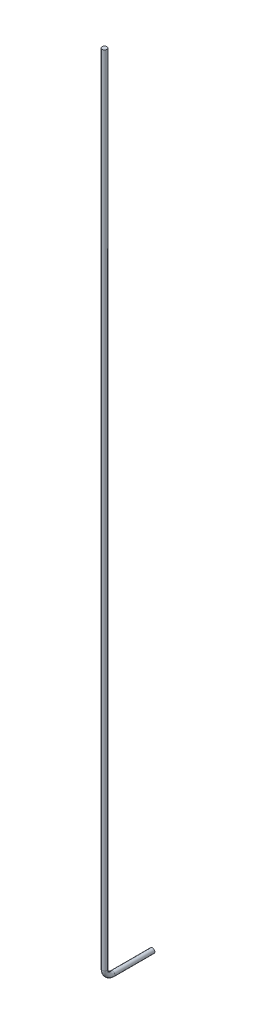
ISO-10303-21;
HEADER;
FILE_DESCRIPTION(('STEP AP214'),'2;1');
FILE_NAME('part.step','',(''),(''),'','','');
FILE_SCHEMA(('AUTOMOTIVE_DESIGN { 1 0 10303 214 1 1 1 1 }'));
ENDSEC;
DATA;
#1=APPLICATION_CONTEXT('core data for automotive mechanical design processes');
#2=APPLICATION_PROTOCOL_DEFINITION('international standard','automotive_design',2000,#1);
#3=PRODUCT_CONTEXT('',#1,'mechanical');
#4=PRODUCT('Part','Part','',(#3));
#5=PRODUCT_RELATED_PRODUCT_CATEGORY('part','',(#4));
#6=PRODUCT_DEFINITION_FORMATION('','',#4);
#7=PRODUCT_DEFINITION_CONTEXT('part definition',#1,'design');
#8=PRODUCT_DEFINITION('design','',#6,#7);
#9=PRODUCT_DEFINITION_SHAPE('','',#8);
#10=(LENGTH_UNIT() NAMED_UNIT(*) SI_UNIT(.MILLI.,.METRE.));
#11=(NAMED_UNIT(*) PLANE_ANGLE_UNIT() SI_UNIT($,.RADIAN.));
#12=(NAMED_UNIT(*) SI_UNIT($,.STERADIAN.) SOLID_ANGLE_UNIT());
#13=UNCERTAINTY_MEASURE_WITH_UNIT(LENGTH_MEASURE(1.E-05),#10,'distance_accuracy_value','');
#14=(GEOMETRIC_REPRESENTATION_CONTEXT(3) GLOBAL_UNCERTAINTY_ASSIGNED_CONTEXT((#13)) GLOBAL_UNIT_ASSIGNED_CONTEXT((#10,
#11,#12)) REPRESENTATION_CONTEXT('',''));
#15=CARTESIAN_POINT('',(0.,0.,0.));
#16=DIRECTION('',(0.,0.,1.));
#17=DIRECTION('',(1.,0.,0.));
#18=AXIS2_PLACEMENT_3D('',#15,#16,#17);
#19=CARTESIAN_POINT('',(0.,0.,20.));
#20=DIRECTION('',(0.,0.,-1.));
#21=DIRECTION('',(-1.,0.,0.));
#22=AXIS2_PLACEMENT_3D('',#19,#20,#21);
#23=CYLINDRICAL_SURFACE('',#22,1.5);
#24=CARTESIAN_POINT('',(0.,0.,0.));
#25=DIRECTION('',(0.,0.,1.));
#26=DIRECTION('',(1.,0.,0.));
#27=AXIS2_PLACEMENT_3D('',#24,#25,#26);
#28=CIRCLE('',#27,1.5);
#29=CARTESIAN_POINT('',(1.5,0.,0.));
#30=VERTEX_POINT('',#29);
#31=EDGE_CURVE('E10',#30,#30,#28,.T.);
#32=ORIENTED_EDGE('',*,*,#31,.T.);
#33=EDGE_LOOP('',(#32));
#34=FACE_BOUND('',#33,.T.);
#35=CARTESIAN_POINT('',(0.,0.,25.));
#36=DIRECTION('',(0.,0.,1.));
#37=DIRECTION('',(1.,0.,0.));
#38=AXIS2_PLACEMENT_3D('',#35,#36,#37);
#39=CIRCLE('',#38,1.5);
#40=CARTESIAN_POINT('',(0.,-1.49999999999984,25.));
#41=VERTEX_POINT('',#40);
#42=EDGE_CURVE('E51',#41,#41,#39,.T.);
#43=ORIENTED_EDGE('',*,*,#42,.F.);
#44=EDGE_LOOP('',(#43));
#45=FACE_BOUND('',#44,.T.);
#46=ADVANCED_FACE('F37',(#34,#45),#23,.T.);
#47=CARTESIAN_POINT('',(0.,0.,0.));
#48=DIRECTION('',(0.,0.,1.));
#49=DIRECTION('',(1.,0.,0.));
#50=AXIS2_PLACEMENT_3D('',#47,#48,#49);
#51=PLANE('',#50);
#52=ORIENTED_EDGE('',*,*,#31,.F.);
#53=EDGE_LOOP('',(#52));
#54=FACE_BOUND('',#53,.T.);
#55=ADVANCED_FACE('F60',(#54),#51,.F.);
#56=CARTESIAN_POINT('',(0.,505.,30.));
#57=DIRECTION('',(0.,1.,0.));
#58=DIRECTION('',(1.,0.,0.));
#59=AXIS2_PLACEMENT_3D('',#56,#57,#58);
#60=PLANE('',#59);
#61=CARTESIAN_POINT('',(0.,505.,30.));
#62=DIRECTION('',(0.,1.,0.));
#63=DIRECTION('',(1.,0.,0.));
#64=AXIS2_PLACEMENT_3D('',#61,#62,#63);
#65=CIRCLE('',#64,1.5);
#66=CARTESIAN_POINT('',(1.5,505.,30.));
#67=VERTEX_POINT('',#66);
#68=EDGE_CURVE('E43',#67,#67,#65,.T.);
#69=ORIENTED_EDGE('',*,*,#68,.T.);
#70=EDGE_LOOP('',(#69));
#71=FACE_BOUND('',#70,.T.);
#72=ADVANCED_FACE('F64',(#71),#60,.T.);
#73=CARTESIAN_POINT('',(0.,5.,25.));
#74=DIRECTION('',(-1.,0.,0.));
#75=DIRECTION('',(0.,0.,1.));
#76=AXIS2_PLACEMENT_3D('',#73,#74,#75);
#77=TOROIDAL_SURFACE('',#76,4.99999999999984,1.5);
#78=CARTESIAN_POINT('',(0.,5.,30.));
#79=DIRECTION('',(0.,1.,0.));
#80=DIRECTION('',(1.,0.,0.));
#81=AXIS2_PLACEMENT_3D('',#78,#79,#80);
#82=CIRCLE('',#81,1.5);
#83=CARTESIAN_POINT('',(0.,5.,31.4999999999998));
#84=VERTEX_POINT('',#83);
#85=EDGE_CURVE('E47',#84,#84,#82,.T.);
#86=CARTESIAN_POINT('',(0.,5.,25.));
#87=DIRECTION('',(-1.,0.,0.));
#88=DIRECTION('',(0.,0.,1.));
#89=AXIS2_PLACEMENT_3D('',#86,#87,#88);
#90=CIRCLE('',#89,6.49999999999984);
#91=EDGE_CURVE('',#41,#84,#90,.T.);
#92=ORIENTED_EDGE('',*,*,#42,.T.);
#93=ORIENTED_EDGE('',*,*,#85,.F.);
#94=ORIENTED_EDGE('',*,*,#91,.T.);
#95=ORIENTED_EDGE('',*,*,#91,.F.);
#96=EDGE_LOOP('',(#92,#94,#93,#95));
#97=FACE_BOUND('',#96,.T.);
#98=ADVANCED_FACE('F57',(#97),#77,.T.);
#99=CARTESIAN_POINT('',(0.,5.,30.));
#100=DIRECTION('',(0.,1.,0.));
#101=DIRECTION('',(0.,0.,1.));
#102=AXIS2_PLACEMENT_3D('',#99,#100,#101);
#103=CYLINDRICAL_SURFACE('',#102,1.5);
#104=ORIENTED_EDGE('',*,*,#68,.F.);
#105=EDGE_LOOP('',(#104));
#106=FACE_BOUND('',#105,.T.);
#107=ORIENTED_EDGE('',*,*,#85,.T.);
#108=EDGE_LOOP('',(#107));
#109=FACE_BOUND('',#108,.T.);
#110=ADVANCED_FACE('F66',(#106,#109),#103,.T.);
#111=CLOSED_SHELL('',(#46,#55,#72,#98,#110));
#112=MANIFOLD_SOLID_BREP('B2',#111);
#113=ADVANCED_BREP_SHAPE_REPRESENTATION('',(#18,#112),#14);
#114=SHAPE_DEFINITION_REPRESENTATION(#9,#113);
ENDSEC;
END-ISO-10303-21;
